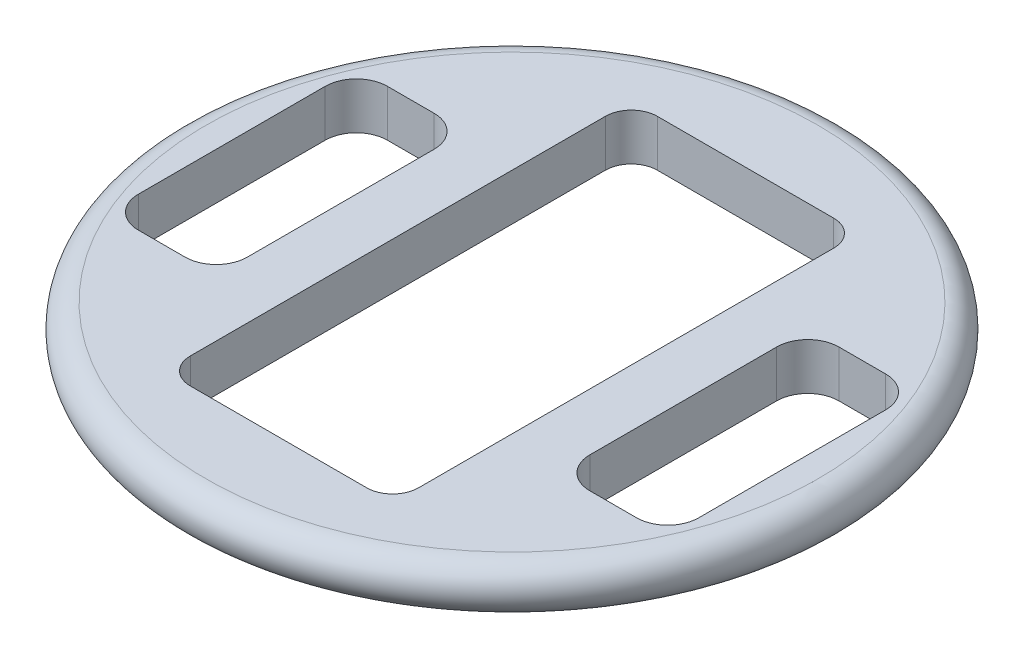
ISO-10303-21;
HEADER;
FILE_DESCRIPTION(('STEP AP214'),'2;1');
FILE_NAME('part.step','',(''),(''),'','','');
FILE_SCHEMA(('AUTOMOTIVE_DESIGN { 1 0 10303 214 1 1 1 1 }'));
ENDSEC;
DATA;
#1=APPLICATION_CONTEXT('core data for automotive mechanical design processes');
#2=APPLICATION_PROTOCOL_DEFINITION('international standard','automotive_design',2000,#1);
#3=PRODUCT_CONTEXT('',#1,'mechanical');
#4=PRODUCT('Part','Part','',(#3));
#5=PRODUCT_RELATED_PRODUCT_CATEGORY('part','',(#4));
#6=PRODUCT_DEFINITION_FORMATION('','',#4);
#7=PRODUCT_DEFINITION_CONTEXT('part definition',#1,'design');
#8=PRODUCT_DEFINITION('design','',#6,#7);
#9=PRODUCT_DEFINITION_SHAPE('','',#8);
#10=(LENGTH_UNIT() NAMED_UNIT(*) SI_UNIT(.MILLI.,.METRE.));
#11=(NAMED_UNIT(*) PLANE_ANGLE_UNIT() SI_UNIT($,.RADIAN.));
#12=(NAMED_UNIT(*) SI_UNIT($,.STERADIAN.) SOLID_ANGLE_UNIT());
#13=UNCERTAINTY_MEASURE_WITH_UNIT(LENGTH_MEASURE(1.E-05),#10,'distance_accuracy_value','');
#14=(GEOMETRIC_REPRESENTATION_CONTEXT(3) GLOBAL_UNCERTAINTY_ASSIGNED_CONTEXT((#13)) GLOBAL_UNIT_ASSIGNED_CONTEXT((#10,
#11,#12)) REPRESENTATION_CONTEXT('',''));
#15=CARTESIAN_POINT('',(0.,0.,0.));
#16=DIRECTION('',(0.,0.,1.));
#17=DIRECTION('',(1.,0.,0.));
#18=AXIS2_PLACEMENT_3D('',#15,#16,#17);
#19=CARTESIAN_POINT('',(0.,4.5,0.));
#20=DIRECTION('',(0.,1.,0.));
#21=DIRECTION('',(0.,0.,1.));
#22=AXIS2_PLACEMENT_3D('',#19,#20,#21);
#23=PLANE('',#22);
#24=CARTESIAN_POINT('',(-8.5,4.5,20.));
#25=DIRECTION('',(0.,1.,0.));
#26=DIRECTION('',(0.,0.,1.));
#27=AXIS2_PLACEMENT_3D('',#24,#25,#26);
#28=CIRCLE('',#27,2.5);
#29=CARTESIAN_POINT('',(-8.5,4.5,22.5));
#30=VERTEX_POINT('',#29);
#31=CARTESIAN_POINT('',(-11.,4.5,20.));
#32=VERTEX_POINT('',#31);
#33=EDGE_CURVE('E354',#30,#32,#28,.F.);
#34=ORIENTED_EDGE('',*,*,#33,.T.);
#35=DIRECTION('',(0.,0.,-1.));
#36=VECTOR('',#35,1.);
#37=CARTESIAN_POINT('',(-11.,4.5,0.));
#38=LINE('',#37,#36);
#39=CARTESIAN_POINT('',(-11.,4.5,-20.));
#40=VERTEX_POINT('',#39);
#41=EDGE_CURVE('E263',#32,#40,#38,.T.);
#42=ORIENTED_EDGE('',*,*,#41,.T.);
#43=CARTESIAN_POINT('',(-8.5,4.5,-20.));
#44=DIRECTION('',(0.,1.,0.));
#45=DIRECTION('',(0.,0.,1.));
#46=AXIS2_PLACEMENT_3D('',#43,#44,#45);
#47=CIRCLE('',#46,2.5);
#48=CARTESIAN_POINT('',(-8.5,4.5,-22.5));
#49=VERTEX_POINT('',#48);
#50=EDGE_CURVE('E335',#40,#49,#47,.F.);
#51=ORIENTED_EDGE('',*,*,#50,.T.);
#52=DIRECTION('',(1.,0.,0.));
#53=VECTOR('',#52,1.);
#54=CARTESIAN_POINT('',(0.,4.5,-22.5));
#55=LINE('',#54,#53);
#56=CARTESIAN_POINT('',(8.49999999999999,4.5,-22.5));
#57=VERTEX_POINT('',#56);
#58=EDGE_CURVE('E369',#49,#57,#55,.T.);
#59=ORIENTED_EDGE('',*,*,#58,.T.);
#60=CARTESIAN_POINT('',(8.49999999999999,4.5,-20.));
#61=DIRECTION('',(0.,1.,0.));
#62=DIRECTION('',(0.,0.,1.));
#63=AXIS2_PLACEMENT_3D('',#60,#61,#62);
#64=CIRCLE('',#63,2.5);
#65=CARTESIAN_POINT('',(11.,4.5,-20.));
#66=VERTEX_POINT('',#65);
#67=EDGE_CURVE('E366',#57,#66,#64,.F.);
#68=ORIENTED_EDGE('',*,*,#67,.T.);
#69=DIRECTION('',(0.,0.,-1.));
#70=VECTOR('',#69,1.);
#71=CARTESIAN_POINT('',(11.,4.5,0.));
#72=LINE('',#71,#70);
#73=CARTESIAN_POINT('',(11.,4.5,20.));
#74=VERTEX_POINT('',#73);
#75=EDGE_CURVE('E363',#74,#66,#72,.T.);
#76=ORIENTED_EDGE('',*,*,#75,.F.);
#77=CARTESIAN_POINT('',(8.5,4.5,20.));
#78=DIRECTION('',(0.,1.,0.));
#79=DIRECTION('',(0.,0.,1.));
#80=AXIS2_PLACEMENT_3D('',#77,#78,#79);
#81=CIRCLE('',#80,2.5);
#82=CARTESIAN_POINT('',(8.5,4.5,22.5));
#83=VERTEX_POINT('',#82);
#84=EDGE_CURVE('E360',#74,#83,#81,.F.);
#85=ORIENTED_EDGE('',*,*,#84,.T.);
#86=DIRECTION('',(1.,0.,0.));
#87=VECTOR('',#86,1.);
#88=CARTESIAN_POINT('',(0.,4.5,22.5));
#89=LINE('',#88,#87);
#90=EDGE_CURVE('E357',#30,#83,#89,.T.);
#91=ORIENTED_EDGE('',*,*,#90,.F.);
#92=EDGE_LOOP('',(#34,#42,#51,#59,#68,#76,#85,#91));
#93=FACE_BOUND('',#92,.T.);
#94=CARTESIAN_POINT('',(0.,4.5,0.));
#95=DIRECTION('',(0.,-1.,0.));
#96=DIRECTION('',(0.,0.,-1.));
#97=AXIS2_PLACEMENT_3D('',#94,#95,#96);
#98=CIRCLE('',#97,29.5);
#99=CARTESIAN_POINT('',(0.,4.5,-29.5));
#100=VERTEX_POINT('',#99);
#101=EDGE_CURVE('E229',#100,#100,#98,.T.);
#102=ORIENTED_EDGE('',*,*,#101,.F.);
#103=EDGE_LOOP('',(#102));
#104=FACE_BOUND('',#103,.T.);
#105=DIRECTION('',(0.,0.,-1.));
#106=VECTOR('',#105,1.);
#107=CARTESIAN_POINT('',(16.5,4.5,9.));
#108=LINE('',#107,#106);
#109=CARTESIAN_POINT('',(16.5,4.5,9.));
#110=VERTEX_POINT('',#109);
#111=CARTESIAN_POINT('',(16.5,4.5,-9.));
#112=VERTEX_POINT('',#111);
#113=EDGE_CURVE('E291',#110,#112,#108,.T.);
#114=ORIENTED_EDGE('',*,*,#113,.T.);
#115=CARTESIAN_POINT('',(19.5,4.5,-9.));
#116=DIRECTION('',(0.,-1.,0.));
#117=DIRECTION('',(0.,0.,-1.));
#118=AXIS2_PLACEMENT_3D('',#115,#116,#117);
#119=CIRCLE('',#118,3.);
#120=CARTESIAN_POINT('',(19.5,4.5,-12.));
#121=VERTEX_POINT('',#120);
#122=EDGE_CURVE('E245',#112,#121,#119,.T.);
#123=ORIENTED_EDGE('',*,*,#122,.T.);
#124=DIRECTION('',(1.,0.,0.));
#125=VECTOR('',#124,1.);
#126=CARTESIAN_POINT('',(19.5,4.5,-12.));
#127=LINE('',#126,#125);
#128=CARTESIAN_POINT('',(24.,4.5,-12.));
#129=VERTEX_POINT('',#128);
#130=EDGE_CURVE('E310',#121,#129,#127,.T.);
#131=ORIENTED_EDGE('',*,*,#130,.T.);
#132=CARTESIAN_POINT('',(24.,4.5,-9.));
#133=DIRECTION('',(0.,1.,0.));
#134=DIRECTION('',(0.,0.,1.));
#135=AXIS2_PLACEMENT_3D('',#132,#133,#134);
#136=CIRCLE('',#135,3.);
#137=CARTESIAN_POINT('',(27.,4.5,-9.));
#138=VERTEX_POINT('',#137);
#139=EDGE_CURVE('E307',#138,#129,#136,.T.);
#140=ORIENTED_EDGE('',*,*,#139,.F.);
#141=DIRECTION('',(0.,0.,1.));
#142=VECTOR('',#141,1.);
#143=CARTESIAN_POINT('',(27.,4.5,-9.));
#144=LINE('',#143,#142);
#145=CARTESIAN_POINT('',(27.,4.5,9.));
#146=VERTEX_POINT('',#145);
#147=EDGE_CURVE('E304',#138,#146,#144,.T.);
#148=ORIENTED_EDGE('',*,*,#147,.T.);
#149=CARTESIAN_POINT('',(24.,4.5,9.));
#150=DIRECTION('',(0.,1.,0.));
#151=DIRECTION('',(0.,0.,1.));
#152=AXIS2_PLACEMENT_3D('',#149,#150,#151);
#153=CIRCLE('',#152,3.);
#154=CARTESIAN_POINT('',(24.,4.5,12.));
#155=VERTEX_POINT('',#154);
#156=EDGE_CURVE('E301',#155,#146,#153,.T.);
#157=ORIENTED_EDGE('',*,*,#156,.F.);
#158=DIRECTION('',(-1.,0.,0.));
#159=VECTOR('',#158,1.);
#160=CARTESIAN_POINT('',(24.,4.5,12.));
#161=LINE('',#160,#159);
#162=CARTESIAN_POINT('',(19.5,4.5,12.));
#163=VERTEX_POINT('',#162);
#164=EDGE_CURVE('E298',#155,#163,#161,.T.);
#165=ORIENTED_EDGE('',*,*,#164,.T.);
#166=CARTESIAN_POINT('',(19.5,4.5,9.));
#167=DIRECTION('',(0.,1.,0.));
#168=DIRECTION('',(0.,0.,1.));
#169=AXIS2_PLACEMENT_3D('',#166,#167,#168);
#170=CIRCLE('',#169,3.);
#171=EDGE_CURVE('E294',#110,#163,#170,.T.);
#172=ORIENTED_EDGE('',*,*,#171,.F.);
#173=EDGE_LOOP('',(#114,#123,#131,#140,#148,#157,#165,#172));
#174=FACE_BOUND('',#173,.T.);
#175=DIRECTION('',(0.,0.,1.));
#176=VECTOR('',#175,1.);
#177=CARTESIAN_POINT('',(-27.,4.5,0.));
#178=LINE('',#177,#176);
#179=CARTESIAN_POINT('',(-27.,4.5,-9.));
#180=VERTEX_POINT('',#179);
#181=CARTESIAN_POINT('',(-27.,4.5,9.));
#182=VERTEX_POINT('',#181);
#183=EDGE_CURVE('E244',#180,#182,#178,.T.);
#184=ORIENTED_EDGE('',*,*,#183,.F.);
#185=CARTESIAN_POINT('',(-24.,4.5,-9.));
#186=DIRECTION('',(0.,1.,0.));
#187=DIRECTION('',(0.,0.,1.));
#188=AXIS2_PLACEMENT_3D('',#185,#186,#187);
#189=CIRCLE('',#188,3.);
#190=CARTESIAN_POINT('',(-24.,4.5,-12.));
#191=VERTEX_POINT('',#190);
#192=EDGE_CURVE('E56',#180,#191,#189,.F.);
#193=ORIENTED_EDGE('',*,*,#192,.T.);
#194=DIRECTION('',(-1.,0.,0.));
#195=VECTOR('',#194,1.);
#196=CARTESIAN_POINT('',(0.,4.5,-12.));
#197=LINE('',#196,#195);
#198=CARTESIAN_POINT('',(-19.5,4.5,-12.));
#199=VERTEX_POINT('',#198);
#200=EDGE_CURVE('E223',#199,#191,#197,.T.);
#201=ORIENTED_EDGE('',*,*,#200,.F.);
#202=CARTESIAN_POINT('',(-19.5,4.5,-9.));
#203=DIRECTION('',(0.,1.,0.));
#204=DIRECTION('',(0.,0.,1.));
#205=AXIS2_PLACEMENT_3D('',#202,#203,#204);
#206=CIRCLE('',#205,3.);
#207=CARTESIAN_POINT('',(-16.5,4.5,-9.));
#208=VERTEX_POINT('',#207);
#209=EDGE_CURVE('E226',#208,#199,#206,.T.);
#210=ORIENTED_EDGE('',*,*,#209,.F.);
#211=DIRECTION('',(0.,0.,-1.));
#212=VECTOR('',#211,1.);
#213=CARTESIAN_POINT('',(-16.5,4.5,0.));
#214=LINE('',#213,#212);
#215=CARTESIAN_POINT('',(-16.5,4.5,9.));
#216=VERTEX_POINT('',#215);
#217=EDGE_CURVE('E256',#216,#208,#214,.T.);
#218=ORIENTED_EDGE('',*,*,#217,.F.);
#219=CARTESIAN_POINT('',(-19.5,4.5,9.));
#220=DIRECTION('',(0.,1.,0.));
#221=DIRECTION('',(0.,0.,1.));
#222=AXIS2_PLACEMENT_3D('',#219,#220,#221);
#223=CIRCLE('',#222,3.);
#224=CARTESIAN_POINT('',(-19.5,4.5,12.));
#225=VERTEX_POINT('',#224);
#226=EDGE_CURVE('E253',#216,#225,#223,.F.);
#227=ORIENTED_EDGE('',*,*,#226,.T.);
#228=DIRECTION('',(1.,0.,0.));
#229=VECTOR('',#228,1.);
#230=CARTESIAN_POINT('',(0.,4.5,12.));
#231=LINE('',#230,#229);
#232=CARTESIAN_POINT('',(-24.,4.5,12.));
#233=VERTEX_POINT('',#232);
#234=EDGE_CURVE('E250',#233,#225,#231,.T.);
#235=ORIENTED_EDGE('',*,*,#234,.F.);
#236=CARTESIAN_POINT('',(-24.,4.5,9.));
#237=DIRECTION('',(0.,1.,0.));
#238=DIRECTION('',(0.,0.,1.));
#239=AXIS2_PLACEMENT_3D('',#236,#237,#238);
#240=CIRCLE('',#239,3.);
#241=EDGE_CURVE('E247',#233,#182,#240,.F.);
#242=ORIENTED_EDGE('',*,*,#241,.T.);
#243=EDGE_LOOP('',(#184,#193,#201,#210,#218,#227,#235,#242));
#244=FACE_BOUND('',#243,.T.);
#245=ADVANCED_FACE('F41',(#93,#104,#174,#244),#23,.T.);
#246=CARTESIAN_POINT('',(0.,0.,0.));
#247=DIRECTION('',(0.,1.,0.));
#248=DIRECTION('',(0.,0.,1.));
#249=AXIS2_PLACEMENT_3D('',#246,#247,#248);
#250=PLANE('',#249);
#251=CARTESIAN_POINT('',(19.5,0.,-9.));
#252=DIRECTION('',(0.,-1.,0.));
#253=DIRECTION('',(0.,0.,-1.));
#254=AXIS2_PLACEMENT_3D('',#251,#252,#253);
#255=CIRCLE('',#254,3.);
#256=CARTESIAN_POINT('',(16.5,0.,-9.));
#257=VERTEX_POINT('',#256);
#258=CARTESIAN_POINT('',(19.5,0.,-12.));
#259=VERTEX_POINT('',#258);
#260=EDGE_CURVE('E329',#257,#259,#255,.T.);
#261=ORIENTED_EDGE('',*,*,#260,.F.);
#262=DIRECTION('',(0.,0.,-1.));
#263=VECTOR('',#262,1.);
#264=CARTESIAN_POINT('',(16.5,0.,0.));
#265=LINE('',#264,#263);
#266=CARTESIAN_POINT('',(16.5,0.,9.));
#267=VERTEX_POINT('',#266);
#268=EDGE_CURVE('E295',#267,#257,#265,.T.);
#269=ORIENTED_EDGE('',*,*,#268,.F.);
#270=CARTESIAN_POINT('',(19.5,0.,9.));
#271=DIRECTION('',(0.,1.,0.));
#272=DIRECTION('',(0.,0.,1.));
#273=AXIS2_PLACEMENT_3D('',#270,#271,#272);
#274=CIRCLE('',#273,3.);
#275=CARTESIAN_POINT('',(19.5,0.,12.));
#276=VERTEX_POINT('',#275);
#277=EDGE_CURVE('E290',#267,#276,#274,.T.);
#278=ORIENTED_EDGE('',*,*,#277,.T.);
#279=DIRECTION('',(-1.,0.,0.));
#280=VECTOR('',#279,1.);
#281=CARTESIAN_POINT('',(24.,0.,12.));
#282=LINE('',#281,#280);
#283=CARTESIAN_POINT('',(24.,0.,12.));
#284=VERTEX_POINT('',#283);
#285=EDGE_CURVE('E317',#284,#276,#282,.T.);
#286=ORIENTED_EDGE('',*,*,#285,.F.);
#287=CARTESIAN_POINT('',(24.,0.,9.));
#288=DIRECTION('',(0.,1.,0.));
#289=DIRECTION('',(0.,0.,1.));
#290=AXIS2_PLACEMENT_3D('',#287,#288,#289);
#291=CIRCLE('',#290,3.);
#292=CARTESIAN_POINT('',(27.,0.,9.));
#293=VERTEX_POINT('',#292);
#294=EDGE_CURVE('E319',#284,#293,#291,.T.);
#295=ORIENTED_EDGE('',*,*,#294,.T.);
#296=DIRECTION('',(0.,0.,1.));
#297=VECTOR('',#296,1.);
#298=CARTESIAN_POINT('',(27.,0.,-9.));
#299=LINE('',#298,#297);
#300=CARTESIAN_POINT('',(27.,0.,-9.));
#301=VERTEX_POINT('',#300);
#302=EDGE_CURVE('E322',#301,#293,#299,.T.);
#303=ORIENTED_EDGE('',*,*,#302,.F.);
#304=CARTESIAN_POINT('',(24.,0.,-9.));
#305=DIRECTION('',(0.,1.,0.));
#306=DIRECTION('',(0.,0.,1.));
#307=AXIS2_PLACEMENT_3D('',#304,#305,#306);
#308=CIRCLE('',#307,3.);
#309=CARTESIAN_POINT('',(24.,0.,-12.));
#310=VERTEX_POINT('',#309);
#311=EDGE_CURVE('E324',#301,#310,#308,.T.);
#312=ORIENTED_EDGE('',*,*,#311,.T.);
#313=DIRECTION('',(1.,0.,0.));
#314=VECTOR('',#313,1.);
#315=CARTESIAN_POINT('',(19.5,0.,-12.));
#316=LINE('',#315,#314);
#317=EDGE_CURVE('E327',#259,#310,#316,.T.);
#318=ORIENTED_EDGE('',*,*,#317,.F.);
#319=EDGE_LOOP('',(#261,#269,#278,#286,#295,#303,#312,#318));
#320=FACE_BOUND('',#319,.T.);
#321=DIRECTION('',(0.,0.,-1.));
#322=VECTOR('',#321,1.);
#323=CARTESIAN_POINT('',(-11.,0.,0.));
#324=LINE('',#323,#322);
#325=CARTESIAN_POINT('',(-11.,0.,20.));
#326=VERTEX_POINT('',#325);
#327=CARTESIAN_POINT('',(-11.,0.,-20.));
#328=VERTEX_POINT('',#327);
#329=EDGE_CURVE('E332',#326,#328,#324,.T.);
#330=ORIENTED_EDGE('',*,*,#329,.F.);
#331=CARTESIAN_POINT('',(-8.5,0.,20.));
#332=DIRECTION('',(0.,1.,0.));
#333=DIRECTION('',(0.,0.,1.));
#334=AXIS2_PLACEMENT_3D('',#331,#332,#333);
#335=CIRCLE('',#334,2.5);
#336=CARTESIAN_POINT('',(-8.5,0.,22.5));
#337=VERTEX_POINT('',#336);
#338=EDGE_CURVE('E334',#337,#326,#335,.F.);
#339=ORIENTED_EDGE('',*,*,#338,.F.);
#340=DIRECTION('',(1.,0.,0.));
#341=VECTOR('',#340,1.);
#342=CARTESIAN_POINT('',(0.,0.,22.5));
#343=LINE('',#342,#341);
#344=CARTESIAN_POINT('',(8.5,0.,22.5));
#345=VERTEX_POINT('',#344);
#346=EDGE_CURVE('E337',#337,#345,#343,.T.);
#347=ORIENTED_EDGE('',*,*,#346,.T.);
#348=CARTESIAN_POINT('',(8.5,0.,20.));
#349=DIRECTION('',(0.,1.,0.));
#350=DIRECTION('',(0.,0.,1.));
#351=AXIS2_PLACEMENT_3D('',#348,#349,#350);
#352=CIRCLE('',#351,2.5);
#353=CARTESIAN_POINT('',(11.,0.,20.));
#354=VERTEX_POINT('',#353);
#355=EDGE_CURVE('E340',#354,#345,#352,.F.);
#356=ORIENTED_EDGE('',*,*,#355,.F.);
#357=DIRECTION('',(0.,0.,-1.));
#358=VECTOR('',#357,1.);
#359=CARTESIAN_POINT('',(11.,0.,0.));
#360=LINE('',#359,#358);
#361=CARTESIAN_POINT('',(11.,0.,-20.));
#362=VERTEX_POINT('',#361);
#363=EDGE_CURVE('E342',#354,#362,#360,.T.);
#364=ORIENTED_EDGE('',*,*,#363,.T.);
#365=CARTESIAN_POINT('',(8.49999999999999,0.,-20.));
#366=DIRECTION('',(0.,1.,0.));
#367=DIRECTION('',(0.,0.,1.));
#368=AXIS2_PLACEMENT_3D('',#365,#366,#367);
#369=CIRCLE('',#368,2.5);
#370=CARTESIAN_POINT('',(8.49999999999999,0.,-22.5));
#371=VERTEX_POINT('',#370);
#372=EDGE_CURVE('E345',#371,#362,#369,.F.);
#373=ORIENTED_EDGE('',*,*,#372,.F.);
#374=DIRECTION('',(1.,0.,0.));
#375=VECTOR('',#374,1.);
#376=CARTESIAN_POINT('',(0.,0.,-22.5));
#377=LINE('',#376,#375);
#378=CARTESIAN_POINT('',(-8.5,0.,-22.5));
#379=VERTEX_POINT('',#378);
#380=EDGE_CURVE('E347',#379,#371,#377,.T.);
#381=ORIENTED_EDGE('',*,*,#380,.F.);
#382=CARTESIAN_POINT('',(-8.5,0.,-20.));
#383=DIRECTION('',(0.,1.,0.));
#384=DIRECTION('',(0.,0.,1.));
#385=AXIS2_PLACEMENT_3D('',#382,#383,#384);
#386=CIRCLE('',#385,2.5);
#387=EDGE_CURVE('E349',#328,#379,#386,.F.);
#388=ORIENTED_EDGE('',*,*,#387,.F.);
#389=EDGE_LOOP('',(#330,#339,#347,#356,#364,#373,#381,#388));
#390=FACE_BOUND('',#389,.T.);
#391=CARTESIAN_POINT('',(0.,0.,0.));
#392=DIRECTION('',(0.,1.,0.));
#393=DIRECTION('',(0.,0.,1.));
#394=AXIS2_PLACEMENT_3D('',#391,#392,#393);
#395=CIRCLE('',#394,29.5);
#396=CARTESIAN_POINT('',(0.,0.,29.5));
#397=VERTEX_POINT('',#396);
#398=EDGE_CURVE('E11',#397,#397,#395,.T.);
#399=ORIENTED_EDGE('',*,*,#398,.F.);
#400=EDGE_LOOP('',(#399));
#401=FACE_BOUND('',#400,.T.);
#402=CARTESIAN_POINT('',(-24.,0.,-9.));
#403=DIRECTION('',(0.,1.,0.));
#404=DIRECTION('',(0.,0.,1.));
#405=AXIS2_PLACEMENT_3D('',#402,#403,#404);
#406=CIRCLE('',#405,3.);
#407=CARTESIAN_POINT('',(-27.,0.,-9.));
#408=VERTEX_POINT('',#407);
#409=CARTESIAN_POINT('',(-24.,0.,-12.));
#410=VERTEX_POINT('',#409);
#411=EDGE_CURVE('E204',#408,#410,#406,.F.);
#412=ORIENTED_EDGE('',*,*,#411,.F.);
#413=DIRECTION('',(0.,0.,1.));
#414=VECTOR('',#413,1.);
#415=CARTESIAN_POINT('',(-27.,0.,0.));
#416=LINE('',#415,#414);
#417=CARTESIAN_POINT('',(-27.,0.,9.));
#418=VERTEX_POINT('',#417);
#419=EDGE_CURVE('E213',#408,#418,#416,.T.);
#420=ORIENTED_EDGE('',*,*,#419,.T.);
#421=CARTESIAN_POINT('',(-24.,0.,9.));
#422=DIRECTION('',(0.,1.,0.));
#423=DIRECTION('',(0.,0.,1.));
#424=AXIS2_PLACEMENT_3D('',#421,#422,#423);
#425=CIRCLE('',#424,3.);
#426=CARTESIAN_POINT('',(-24.,0.,12.));
#427=VERTEX_POINT('',#426);
#428=EDGE_CURVE('E218',#427,#418,#425,.F.);
#429=ORIENTED_EDGE('',*,*,#428,.F.);
#430=DIRECTION('',(1.,0.,0.));
#431=VECTOR('',#430,1.);
#432=CARTESIAN_POINT('',(0.,0.,12.));
#433=LINE('',#432,#431);
#434=CARTESIAN_POINT('',(-19.5,0.,12.));
#435=VERTEX_POINT('',#434);
#436=EDGE_CURVE('E232',#427,#435,#433,.T.);
#437=ORIENTED_EDGE('',*,*,#436,.T.);
#438=CARTESIAN_POINT('',(-19.5,0.,9.));
#439=DIRECTION('',(0.,1.,0.));
#440=DIRECTION('',(0.,0.,1.));
#441=AXIS2_PLACEMENT_3D('',#438,#439,#440);
#442=CIRCLE('',#441,3.);
#443=CARTESIAN_POINT('',(-16.5,0.,9.));
#444=VERTEX_POINT('',#443);
#445=EDGE_CURVE('E235',#444,#435,#442,.F.);
#446=ORIENTED_EDGE('',*,*,#445,.F.);
#447=DIRECTION('',(0.,0.,-1.));
#448=VECTOR('',#447,1.);
#449=CARTESIAN_POINT('',(-16.5,0.,0.));
#450=LINE('',#449,#448);
#451=CARTESIAN_POINT('',(-16.5,0.,-9.));
#452=VERTEX_POINT('',#451);
#453=EDGE_CURVE('E237',#444,#452,#450,.T.);
#454=ORIENTED_EDGE('',*,*,#453,.T.);
#455=CARTESIAN_POINT('',(-19.5,0.,-9.));
#456=DIRECTION('',(0.,1.,0.));
#457=DIRECTION('',(0.,0.,1.));
#458=AXIS2_PLACEMENT_3D('',#455,#456,#457);
#459=CIRCLE('',#458,3.);
#460=CARTESIAN_POINT('',(-19.5,0.,-12.));
#461=VERTEX_POINT('',#460);
#462=EDGE_CURVE('E240',#452,#461,#459,.T.);
#463=ORIENTED_EDGE('',*,*,#462,.T.);
#464=DIRECTION('',(-1.,0.,0.));
#465=VECTOR('',#464,1.);
#466=CARTESIAN_POINT('',(0.,0.,-12.));
#467=LINE('',#466,#465);
#468=EDGE_CURVE('E210',#461,#410,#467,.T.);
#469=ORIENTED_EDGE('',*,*,#468,.T.);
#470=EDGE_LOOP('',(#412,#420,#429,#437,#446,#454,#463,#469));
#471=FACE_BOUND('',#470,.T.);
#472=ADVANCED_FACE('F43',(#320,#390,#401,#471),#250,.F.);
#473=CARTESIAN_POINT('',(-11.,0.,0.));
#474=DIRECTION('',(1.,0.,0.));
#475=DIRECTION('',(0.,0.,-1.));
#476=AXIS2_PLACEMENT_3D('',#473,#474,#475);
#477=PLANE('',#476);
#478=ORIENTED_EDGE('',*,*,#41,.F.);
#479=DIRECTION('',(0.,1.,0.));
#480=VECTOR('',#479,1.);
#481=CARTESIAN_POINT('',(-11.,0.,20.));
#482=LINE('',#481,#480);
#483=EDGE_CURVE('E351',#326,#32,#482,.T.);
#484=ORIENTED_EDGE('',*,*,#483,.F.);
#485=ORIENTED_EDGE('',*,*,#329,.T.);
#486=DIRECTION('',(0.,1.,0.));
#487=VECTOR('',#486,1.);
#488=CARTESIAN_POINT('',(-11.,0.,-20.));
#489=LINE('',#488,#487);
#490=EDGE_CURVE('E49',#328,#40,#489,.T.);
#491=ORIENTED_EDGE('',*,*,#490,.T.);
#492=EDGE_LOOP('',(#478,#484,#485,#491));
#493=FACE_BOUND('',#492,.T.);
#494=ADVANCED_FACE('F410',(#493),#477,.T.);
#495=CARTESIAN_POINT('',(-8.5,0.,-20.));
#496=DIRECTION('',(0.,1.,0.));
#497=DIRECTION('',(0.,0.,1.));
#498=AXIS2_PLACEMENT_3D('',#495,#496,#497);
#499=CYLINDRICAL_SURFACE('',#498,2.5);
#500=ORIENTED_EDGE('',*,*,#50,.F.);
#501=ORIENTED_EDGE('',*,*,#490,.F.);
#502=ORIENTED_EDGE('',*,*,#387,.T.);
#503=DIRECTION('',(0.,1.,0.));
#504=VECTOR('',#503,1.);
#505=CARTESIAN_POINT('',(-8.5,0.,-22.5));
#506=LINE('',#505,#504);
#507=EDGE_CURVE('E376',#379,#49,#506,.T.);
#508=ORIENTED_EDGE('',*,*,#507,.T.);
#509=EDGE_LOOP('',(#500,#501,#502,#508));
#510=FACE_BOUND('',#509,.T.);
#511=ADVANCED_FACE('F412',(#510),#499,.F.);
#512=CARTESIAN_POINT('',(0.,0.,-22.5));
#513=DIRECTION('',(0.,0.,1.));
#514=DIRECTION('',(1.,0.,0.));
#515=AXIS2_PLACEMENT_3D('',#512,#513,#514);
#516=PLANE('',#515);
#517=ORIENTED_EDGE('',*,*,#58,.F.);
#518=ORIENTED_EDGE('',*,*,#507,.F.);
#519=ORIENTED_EDGE('',*,*,#380,.T.);
#520=DIRECTION('',(0.,1.,0.));
#521=VECTOR('',#520,1.);
#522=CARTESIAN_POINT('',(8.49999999999999,0.,-22.5));
#523=LINE('',#522,#521);
#524=EDGE_CURVE('E378',#371,#57,#523,.T.);
#525=ORIENTED_EDGE('',*,*,#524,.T.);
#526=EDGE_LOOP('',(#517,#518,#519,#525));
#527=FACE_BOUND('',#526,.T.);
#528=ADVANCED_FACE('F417',(#527),#516,.T.);
#529=CARTESIAN_POINT('',(8.49999999999999,0.,-20.));
#530=DIRECTION('',(0.,1.,0.));
#531=DIRECTION('',(0.,0.,1.));
#532=AXIS2_PLACEMENT_3D('',#529,#530,#531);
#533=CYLINDRICAL_SURFACE('',#532,2.5);
#534=ORIENTED_EDGE('',*,*,#67,.F.);
#535=ORIENTED_EDGE('',*,*,#524,.F.);
#536=ORIENTED_EDGE('',*,*,#372,.T.);
#537=DIRECTION('',(0.,1.,0.));
#538=VECTOR('',#537,1.);
#539=CARTESIAN_POINT('',(11.,0.,-20.));
#540=LINE('',#539,#538);
#541=EDGE_CURVE('E380',#362,#66,#540,.T.);
#542=ORIENTED_EDGE('',*,*,#541,.T.);
#543=EDGE_LOOP('',(#534,#535,#536,#542));
#544=FACE_BOUND('',#543,.T.);
#545=ADVANCED_FACE('F421',(#544),#533,.F.);
#546=CARTESIAN_POINT('',(11.,0.,0.));
#547=DIRECTION('',(1.,0.,0.));
#548=DIRECTION('',(0.,0.,-1.));
#549=AXIS2_PLACEMENT_3D('',#546,#547,#548);
#550=PLANE('',#549);
#551=ORIENTED_EDGE('',*,*,#75,.T.);
#552=ORIENTED_EDGE('',*,*,#541,.F.);
#553=ORIENTED_EDGE('',*,*,#363,.F.);
#554=DIRECTION('',(0.,1.,0.));
#555=VECTOR('',#554,1.);
#556=CARTESIAN_POINT('',(11.,0.,20.));
#557=LINE('',#556,#555);
#558=EDGE_CURVE('E382',#354,#74,#557,.T.);
#559=ORIENTED_EDGE('',*,*,#558,.T.);
#560=EDGE_LOOP('',(#551,#552,#553,#559));
#561=FACE_BOUND('',#560,.T.);
#562=ADVANCED_FACE('F425',(#561),#550,.F.);
#563=CARTESIAN_POINT('',(8.5,0.,20.));
#564=DIRECTION('',(0.,1.,0.));
#565=DIRECTION('',(0.,0.,1.));
#566=AXIS2_PLACEMENT_3D('',#563,#564,#565);
#567=CYLINDRICAL_SURFACE('',#566,2.5);
#568=ORIENTED_EDGE('',*,*,#84,.F.);
#569=ORIENTED_EDGE('',*,*,#558,.F.);
#570=ORIENTED_EDGE('',*,*,#355,.T.);
#571=DIRECTION('',(0.,1.,0.));
#572=VECTOR('',#571,1.);
#573=CARTESIAN_POINT('',(8.5,0.,22.5));
#574=LINE('',#573,#572);
#575=EDGE_CURVE('E384',#345,#83,#574,.T.);
#576=ORIENTED_EDGE('',*,*,#575,.T.);
#577=EDGE_LOOP('',(#568,#569,#570,#576));
#578=FACE_BOUND('',#577,.T.);
#579=ADVANCED_FACE('F427',(#578),#567,.F.);
#580=CARTESIAN_POINT('',(0.,0.,22.5));
#581=DIRECTION('',(0.,0.,1.));
#582=DIRECTION('',(1.,0.,0.));
#583=AXIS2_PLACEMENT_3D('',#580,#581,#582);
#584=PLANE('',#583);
#585=ORIENTED_EDGE('',*,*,#90,.T.);
#586=ORIENTED_EDGE('',*,*,#575,.F.);
#587=ORIENTED_EDGE('',*,*,#346,.F.);
#588=DIRECTION('',(0.,1.,0.));
#589=VECTOR('',#588,1.);
#590=CARTESIAN_POINT('',(-8.5,0.,22.5));
#591=LINE('',#590,#589);
#592=EDGE_CURVE('E386',#337,#30,#591,.T.);
#593=ORIENTED_EDGE('',*,*,#592,.T.);
#594=EDGE_LOOP('',(#585,#586,#587,#593));
#595=FACE_BOUND('',#594,.T.);
#596=ADVANCED_FACE('F403',(#595),#584,.F.);
#597=CARTESIAN_POINT('',(-8.5,0.,20.));
#598=DIRECTION('',(0.,1.,0.));
#599=DIRECTION('',(0.,0.,1.));
#600=AXIS2_PLACEMENT_3D('',#597,#598,#599);
#601=CYLINDRICAL_SURFACE('',#600,2.5);
#602=ORIENTED_EDGE('',*,*,#33,.F.);
#603=ORIENTED_EDGE('',*,*,#592,.F.);
#604=ORIENTED_EDGE('',*,*,#338,.T.);
#605=ORIENTED_EDGE('',*,*,#483,.T.);
#606=EDGE_LOOP('',(#602,#603,#604,#605));
#607=FACE_BOUND('',#606,.T.);
#608=ADVANCED_FACE('F391',(#607),#601,.F.);
#609=CARTESIAN_POINT('',(19.5,0.,-9.));
#610=DIRECTION('',(0.,1.,0.));
#611=DIRECTION('',(0.,0.,1.));
#612=AXIS2_PLACEMENT_3D('',#609,#610,#611);
#613=CYLINDRICAL_SURFACE('',#612,3.);
#614=ORIENTED_EDGE('',*,*,#122,.F.);
#615=DIRECTION('',(0.,1.,0.));
#616=VECTOR('',#615,1.);
#617=CARTESIAN_POINT('',(16.5,0.,-9.));
#618=LINE('',#617,#616);
#619=EDGE_CURVE('E64',#257,#112,#618,.T.);
#620=ORIENTED_EDGE('',*,*,#619,.F.);
#621=ORIENTED_EDGE('',*,*,#260,.T.);
#622=DIRECTION('',(0.,1.,0.));
#623=VECTOR('',#622,1.);
#624=CARTESIAN_POINT('',(19.5,0.,-12.));
#625=LINE('',#624,#623);
#626=EDGE_CURVE('E276',#259,#121,#625,.T.);
#627=ORIENTED_EDGE('',*,*,#626,.T.);
#628=EDGE_LOOP('',(#614,#620,#621,#627));
#629=FACE_BOUND('',#628,.T.);
#630=ADVANCED_FACE('F445',(#629),#613,.F.);
#631=CARTESIAN_POINT('',(19.5,0.,-12.));
#632=DIRECTION('',(0.,0.,1.));
#633=DIRECTION('',(1.,0.,0.));
#634=AXIS2_PLACEMENT_3D('',#631,#632,#633);
#635=PLANE('',#634);
#636=ORIENTED_EDGE('',*,*,#130,.F.);
#637=ORIENTED_EDGE('',*,*,#626,.F.);
#638=ORIENTED_EDGE('',*,*,#317,.T.);
#639=DIRECTION('',(0.,1.,0.));
#640=VECTOR('',#639,1.);
#641=CARTESIAN_POINT('',(24.,0.,-12.));
#642=LINE('',#641,#640);
#643=EDGE_CURVE('E278',#310,#129,#642,.T.);
#644=ORIENTED_EDGE('',*,*,#643,.T.);
#645=EDGE_LOOP('',(#636,#637,#638,#644));
#646=FACE_BOUND('',#645,.T.);
#647=ADVANCED_FACE('F449',(#646),#635,.T.);
#648=CARTESIAN_POINT('',(24.,0.,-9.));
#649=DIRECTION('',(0.,1.,0.));
#650=DIRECTION('',(0.,0.,1.));
#651=AXIS2_PLACEMENT_3D('',#648,#649,#650);
#652=CYLINDRICAL_SURFACE('',#651,3.);
#653=ORIENTED_EDGE('',*,*,#139,.T.);
#654=ORIENTED_EDGE('',*,*,#643,.F.);
#655=ORIENTED_EDGE('',*,*,#311,.F.);
#656=DIRECTION('',(0.,1.,0.));
#657=VECTOR('',#656,1.);
#658=CARTESIAN_POINT('',(27.,0.,-9.));
#659=LINE('',#658,#657);
#660=EDGE_CURVE('E280',#301,#138,#659,.T.);
#661=ORIENTED_EDGE('',*,*,#660,.T.);
#662=EDGE_LOOP('',(#653,#654,#655,#661));
#663=FACE_BOUND('',#662,.T.);
#664=ADVANCED_FACE('F455',(#663),#652,.F.);
#665=CARTESIAN_POINT('',(27.,0.,-9.));
#666=DIRECTION('',(-1.,0.,0.));
#667=DIRECTION('',(0.,0.,1.));
#668=AXIS2_PLACEMENT_3D('',#665,#666,#667);
#669=PLANE('',#668);
#670=ORIENTED_EDGE('',*,*,#147,.F.);
#671=ORIENTED_EDGE('',*,*,#660,.F.);
#672=ORIENTED_EDGE('',*,*,#302,.T.);
#673=DIRECTION('',(0.,1.,0.));
#674=VECTOR('',#673,1.);
#675=CARTESIAN_POINT('',(27.,0.,9.));
#676=LINE('',#675,#674);
#677=EDGE_CURVE('E282',#293,#146,#676,.T.);
#678=ORIENTED_EDGE('',*,*,#677,.T.);
#679=EDGE_LOOP('',(#670,#671,#672,#678));
#680=FACE_BOUND('',#679,.T.);
#681=ADVANCED_FACE('F463',(#680),#669,.T.);
#682=CARTESIAN_POINT('',(24.,0.,9.));
#683=DIRECTION('',(0.,1.,0.));
#684=DIRECTION('',(0.,0.,1.));
#685=AXIS2_PLACEMENT_3D('',#682,#683,#684);
#686=CYLINDRICAL_SURFACE('',#685,3.);
#687=ORIENTED_EDGE('',*,*,#156,.T.);
#688=ORIENTED_EDGE('',*,*,#677,.F.);
#689=ORIENTED_EDGE('',*,*,#294,.F.);
#690=DIRECTION('',(0.,1.,0.));
#691=VECTOR('',#690,1.);
#692=CARTESIAN_POINT('',(24.,0.,12.));
#693=LINE('',#692,#691);
#694=EDGE_CURVE('E284',#284,#155,#693,.T.);
#695=ORIENTED_EDGE('',*,*,#694,.T.);
#696=EDGE_LOOP('',(#687,#688,#689,#695));
#697=FACE_BOUND('',#696,.T.);
#698=ADVANCED_FACE('F467',(#697),#686,.F.);
#699=CARTESIAN_POINT('',(24.,0.,12.));
#700=DIRECTION('',(0.,0.,-1.));
#701=DIRECTION('',(-1.,0.,0.));
#702=AXIS2_PLACEMENT_3D('',#699,#700,#701);
#703=PLANE('',#702);
#704=ORIENTED_EDGE('',*,*,#164,.F.);
#705=ORIENTED_EDGE('',*,*,#694,.F.);
#706=ORIENTED_EDGE('',*,*,#285,.T.);
#707=DIRECTION('',(0.,1.,0.));
#708=VECTOR('',#707,1.);
#709=CARTESIAN_POINT('',(19.5,0.,12.));
#710=LINE('',#709,#708);
#711=EDGE_CURVE('E286',#276,#163,#710,.T.);
#712=ORIENTED_EDGE('',*,*,#711,.T.);
#713=EDGE_LOOP('',(#704,#705,#706,#712));
#714=FACE_BOUND('',#713,.T.);
#715=ADVANCED_FACE('F471',(#714),#703,.T.);
#716=CARTESIAN_POINT('',(19.5,0.,9.));
#717=DIRECTION('',(0.,1.,0.));
#718=DIRECTION('',(0.,0.,1.));
#719=AXIS2_PLACEMENT_3D('',#716,#717,#718);
#720=CYLINDRICAL_SURFACE('',#719,3.);
#721=ORIENTED_EDGE('',*,*,#171,.T.);
#722=ORIENTED_EDGE('',*,*,#711,.F.);
#723=ORIENTED_EDGE('',*,*,#277,.F.);
#724=DIRECTION('',(0.,1.,0.));
#725=VECTOR('',#724,1.);
#726=CARTESIAN_POINT('',(16.5,0.,9.));
#727=LINE('',#726,#725);
#728=EDGE_CURVE('E288',#267,#110,#727,.T.);
#729=ORIENTED_EDGE('',*,*,#728,.T.);
#730=EDGE_LOOP('',(#721,#722,#723,#729));
#731=FACE_BOUND('',#730,.T.);
#732=ADVANCED_FACE('F475',(#731),#720,.F.);
#733=CARTESIAN_POINT('',(16.5,0.,9.));
#734=DIRECTION('',(1.,0.,0.));
#735=DIRECTION('',(0.,0.,-1.));
#736=AXIS2_PLACEMENT_3D('',#733,#734,#735);
#737=PLANE('',#736);
#738=ORIENTED_EDGE('',*,*,#113,.F.);
#739=ORIENTED_EDGE('',*,*,#728,.F.);
#740=ORIENTED_EDGE('',*,*,#268,.T.);
#741=ORIENTED_EDGE('',*,*,#619,.T.);
#742=EDGE_LOOP('',(#738,#739,#740,#741));
#743=FACE_BOUND('',#742,.T.);
#744=ADVANCED_FACE('F479',(#743),#737,.T.);
#745=CARTESIAN_POINT('',(-24.,0.,-9.));
#746=DIRECTION('',(0.,1.,0.));
#747=DIRECTION('',(0.,0.,1.));
#748=AXIS2_PLACEMENT_3D('',#745,#746,#747);
#749=CYLINDRICAL_SURFACE('',#748,3.);
#750=ORIENTED_EDGE('',*,*,#192,.F.);
#751=DIRECTION('',(0.,1.,0.));
#752=VECTOR('',#751,1.);
#753=CARTESIAN_POINT('',(-27.,0.,-9.));
#754=LINE('',#753,#752);
#755=EDGE_CURVE('E200',#408,#180,#754,.T.);
#756=ORIENTED_EDGE('',*,*,#755,.F.);
#757=ORIENTED_EDGE('',*,*,#411,.T.);
#758=DIRECTION('',(0.,1.,0.));
#759=VECTOR('',#758,1.);
#760=CARTESIAN_POINT('',(-24.,0.,-12.));
#761=LINE('',#760,#759);
#762=EDGE_CURVE('E261',#410,#191,#761,.T.);
#763=ORIENTED_EDGE('',*,*,#762,.T.);
#764=EDGE_LOOP('',(#750,#756,#757,#763));
#765=FACE_BOUND('',#764,.T.);
#766=ADVANCED_FACE('F202',(#765),#749,.F.);
#767=CARTESIAN_POINT('',(0.,0.,-12.));
#768=DIRECTION('',(0.,0.,-1.));
#769=DIRECTION('',(-1.,0.,0.));
#770=AXIS2_PLACEMENT_3D('',#767,#768,#769);
#771=PLANE('',#770);
#772=ORIENTED_EDGE('',*,*,#200,.T.);
#773=ORIENTED_EDGE('',*,*,#762,.F.);
#774=ORIENTED_EDGE('',*,*,#468,.F.);
#775=DIRECTION('',(0.,1.,0.));
#776=VECTOR('',#775,1.);
#777=CARTESIAN_POINT('',(-19.5,0.,-12.));
#778=LINE('',#777,#776);
#779=EDGE_CURVE('E264',#461,#199,#778,.T.);
#780=ORIENTED_EDGE('',*,*,#779,.T.);
#781=EDGE_LOOP('',(#772,#773,#774,#780));
#782=FACE_BOUND('',#781,.T.);
#783=ADVANCED_FACE('F580',(#782),#771,.F.);
#784=CARTESIAN_POINT('',(-19.5,0.,-9.));
#785=DIRECTION('',(0.,1.,0.));
#786=DIRECTION('',(0.,0.,1.));
#787=AXIS2_PLACEMENT_3D('',#784,#785,#786);
#788=CYLINDRICAL_SURFACE('',#787,3.);
#789=ORIENTED_EDGE('',*,*,#209,.T.);
#790=ORIENTED_EDGE('',*,*,#779,.F.);
#791=ORIENTED_EDGE('',*,*,#462,.F.);
#792=DIRECTION('',(0.,1.,0.));
#793=VECTOR('',#792,1.);
#794=CARTESIAN_POINT('',(-16.5,0.,-9.));
#795=LINE('',#794,#793);
#796=EDGE_CURVE('E266',#452,#208,#795,.T.);
#797=ORIENTED_EDGE('',*,*,#796,.T.);
#798=EDGE_LOOP('',(#789,#790,#791,#797));
#799=FACE_BOUND('',#798,.T.);
#800=ADVANCED_FACE('F588',(#799),#788,.F.);
#801=CARTESIAN_POINT('',(-16.5,0.,0.));
#802=DIRECTION('',(1.,0.,0.));
#803=DIRECTION('',(0.,0.,-1.));
#804=AXIS2_PLACEMENT_3D('',#801,#802,#803);
#805=PLANE('',#804);
#806=ORIENTED_EDGE('',*,*,#217,.T.);
#807=ORIENTED_EDGE('',*,*,#796,.F.);
#808=ORIENTED_EDGE('',*,*,#453,.F.);
#809=DIRECTION('',(0.,1.,0.));
#810=VECTOR('',#809,1.);
#811=CARTESIAN_POINT('',(-16.5,0.,9.));
#812=LINE('',#811,#810);
#813=EDGE_CURVE('E268',#444,#216,#812,.T.);
#814=ORIENTED_EDGE('',*,*,#813,.T.);
#815=EDGE_LOOP('',(#806,#807,#808,#814));
#816=FACE_BOUND('',#815,.T.);
#817=ADVANCED_FACE('F598',(#816),#805,.F.);
#818=CARTESIAN_POINT('',(-19.5,0.,9.));
#819=DIRECTION('',(0.,1.,0.));
#820=DIRECTION('',(0.,0.,1.));
#821=AXIS2_PLACEMENT_3D('',#818,#819,#820);
#822=CYLINDRICAL_SURFACE('',#821,3.);
#823=ORIENTED_EDGE('',*,*,#226,.F.);
#824=ORIENTED_EDGE('',*,*,#813,.F.);
#825=ORIENTED_EDGE('',*,*,#445,.T.);
#826=DIRECTION('',(0.,1.,0.));
#827=VECTOR('',#826,1.);
#828=CARTESIAN_POINT('',(-19.5,0.,12.));
#829=LINE('',#828,#827);
#830=EDGE_CURVE('E270',#435,#225,#829,.T.);
#831=ORIENTED_EDGE('',*,*,#830,.T.);
#832=EDGE_LOOP('',(#823,#824,#825,#831));
#833=FACE_BOUND('',#832,.T.);
#834=ADVANCED_FACE('F608',(#833),#822,.F.);
#835=CARTESIAN_POINT('',(0.,0.,12.));
#836=DIRECTION('',(0.,0.,1.));
#837=DIRECTION('',(1.,0.,0.));
#838=AXIS2_PLACEMENT_3D('',#835,#836,#837);
#839=PLANE('',#838);
#840=ORIENTED_EDGE('',*,*,#234,.T.);
#841=ORIENTED_EDGE('',*,*,#830,.F.);
#842=ORIENTED_EDGE('',*,*,#436,.F.);
#843=DIRECTION('',(0.,1.,0.));
#844=VECTOR('',#843,1.);
#845=CARTESIAN_POINT('',(-24.,0.,12.));
#846=LINE('',#845,#844);
#847=EDGE_CURVE('E272',#427,#233,#846,.T.);
#848=ORIENTED_EDGE('',*,*,#847,.T.);
#849=EDGE_LOOP('',(#840,#841,#842,#848));
#850=FACE_BOUND('',#849,.T.);
#851=ADVANCED_FACE('F621',(#850),#839,.F.);
#852=CARTESIAN_POINT('',(-24.,0.,9.));
#853=DIRECTION('',(0.,1.,0.));
#854=DIRECTION('',(0.,0.,1.));
#855=AXIS2_PLACEMENT_3D('',#852,#853,#854);
#856=CYLINDRICAL_SURFACE('',#855,3.);
#857=ORIENTED_EDGE('',*,*,#241,.F.);
#858=ORIENTED_EDGE('',*,*,#847,.F.);
#859=ORIENTED_EDGE('',*,*,#428,.T.);
#860=DIRECTION('',(0.,1.,0.));
#861=VECTOR('',#860,1.);
#862=CARTESIAN_POINT('',(-27.,0.,9.));
#863=LINE('',#862,#861);
#864=EDGE_CURVE('E209',#418,#182,#863,.T.);
#865=ORIENTED_EDGE('',*,*,#864,.T.);
#866=EDGE_LOOP('',(#857,#858,#859,#865));
#867=FACE_BOUND('',#866,.T.);
#868=ADVANCED_FACE('F631',(#867),#856,.F.);
#869=CARTESIAN_POINT('',(-27.,0.,0.));
#870=DIRECTION('',(-1.,0.,0.));
#871=DIRECTION('',(0.,0.,1.));
#872=AXIS2_PLACEMENT_3D('',#869,#870,#871);
#873=PLANE('',#872);
#874=ORIENTED_EDGE('',*,*,#183,.T.);
#875=ORIENTED_EDGE('',*,*,#864,.F.);
#876=ORIENTED_EDGE('',*,*,#419,.F.);
#877=ORIENTED_EDGE('',*,*,#755,.T.);
#878=EDGE_LOOP('',(#874,#875,#876,#877));
#879=FACE_BOUND('',#878,.T.);
#880=ADVANCED_FACE('F214',(#879),#873,.F.);
#881=CARTESIAN_POINT('',(0.,2.25,0.));
#882=DIRECTION('',(0.,-1.,0.));
#883=DIRECTION('',(0.,0.,-1.));
#884=AXIS2_PLACEMENT_3D('',#881,#882,#883);
#885=TOROIDAL_SURFACE('',#884,29.5,2.25);
#886=ORIENTED_EDGE('',*,*,#101,.T.);
#887=EDGE_LOOP('',(#886));
#888=FACE_BOUND('',#887,.T.);
#889=ORIENTED_EDGE('',*,*,#398,.T.);
#890=EDGE_LOOP('',(#889));
#891=FACE_BOUND('',#890,.T.);
#892=ADVANCED_FACE('F650',(#888,#891),#885,.T.);
#893=CLOSED_SHELL('',(#245,#472,#494,#511,#528,#545,#562,#579,#596,#608,#630,#647,#664,#681,
#698,#715,#732,#744,#766,#783,#800,#817,#834,#851,#868,#880,#892));
#894=MANIFOLD_SOLID_BREP('B2',#893);
#895=ADVANCED_BREP_SHAPE_REPRESENTATION('',(#18,#894),#14);
#896=SHAPE_DEFINITION_REPRESENTATION(#9,#895);
ENDSEC;
END-ISO-10303-21;
